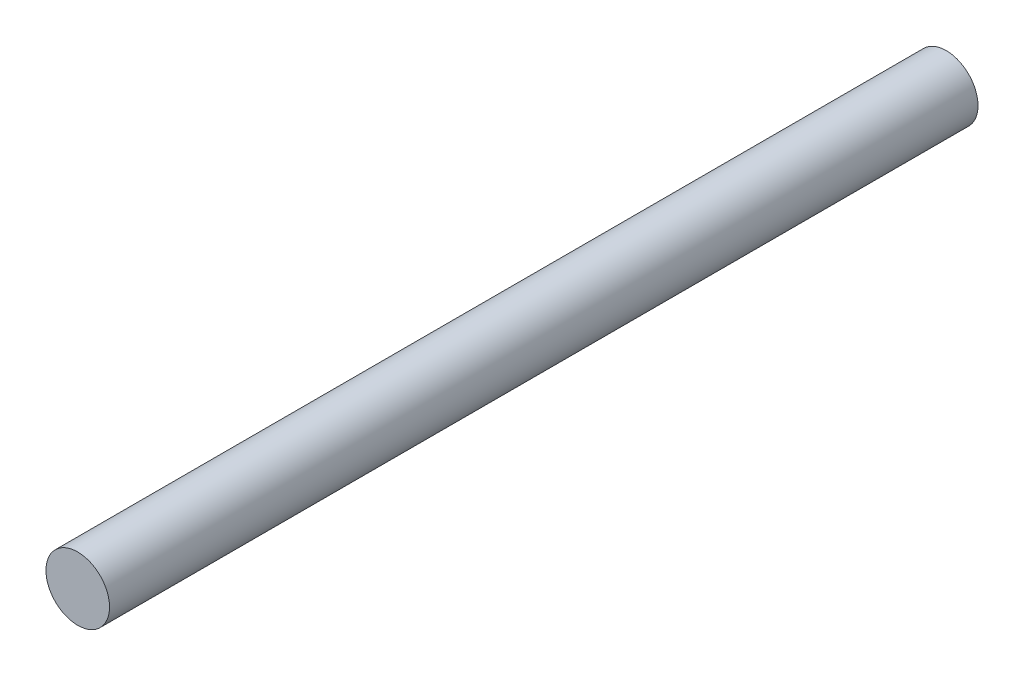
ISO-10303-21;
HEADER;
FILE_DESCRIPTION(('STEP AP214'),'2;1');
FILE_NAME('part.step','',(''),(''),'','','');
FILE_SCHEMA(('AUTOMOTIVE_DESIGN { 1 0 10303 214 1 1 1 1 }'));
ENDSEC;
DATA;
#1=APPLICATION_CONTEXT('core data for automotive mechanical design processes');
#2=APPLICATION_PROTOCOL_DEFINITION('international standard','automotive_design',2000,#1);
#3=PRODUCT_CONTEXT('',#1,'mechanical');
#4=PRODUCT('Part','Part','',(#3));
#5=PRODUCT_RELATED_PRODUCT_CATEGORY('part','',(#4));
#6=PRODUCT_DEFINITION_FORMATION('','',#4);
#7=PRODUCT_DEFINITION_CONTEXT('part definition',#1,'design');
#8=PRODUCT_DEFINITION('design','',#6,#7);
#9=PRODUCT_DEFINITION_SHAPE('','',#8);
#10=(LENGTH_UNIT() NAMED_UNIT(*) SI_UNIT(.MILLI.,.METRE.));
#11=(NAMED_UNIT(*) PLANE_ANGLE_UNIT() SI_UNIT($,.RADIAN.));
#12=(NAMED_UNIT(*) SI_UNIT($,.STERADIAN.) SOLID_ANGLE_UNIT());
#13=UNCERTAINTY_MEASURE_WITH_UNIT(LENGTH_MEASURE(1.E-05),#10,'distance_accuracy_value','');
#14=(GEOMETRIC_REPRESENTATION_CONTEXT(3) GLOBAL_UNCERTAINTY_ASSIGNED_CONTEXT((#13)) GLOBAL_UNIT_ASSIGNED_CONTEXT((#10,
#11,#12)) REPRESENTATION_CONTEXT('',''));
#15=CARTESIAN_POINT('',(0.,0.,0.));
#16=DIRECTION('',(0.,0.,1.));
#17=DIRECTION('',(1.,0.,0.));
#18=AXIS2_PLACEMENT_3D('',#15,#16,#17);
#19=CARTESIAN_POINT('',(0.,0.,53.));
#20=DIRECTION('',(0.,0.,-1.));
#21=DIRECTION('',(-1.,0.,0.));
#22=AXIS2_PLACEMENT_3D('',#19,#20,#21);
#23=CYLINDRICAL_SURFACE('',#22,1.94);
#24=CARTESIAN_POINT('',(0.,0.,53.));
#25=DIRECTION('',(0.,0.,1.));
#26=DIRECTION('',(1.,0.,0.));
#27=AXIS2_PLACEMENT_3D('',#24,#25,#26);
#28=CIRCLE('',#27,1.94);
#29=CARTESIAN_POINT('',(1.94,0.,53.));
#30=VERTEX_POINT('',#29);
#31=EDGE_CURVE('E10',#30,#30,#28,.T.);
#32=ORIENTED_EDGE('',*,*,#31,.F.);
#33=EDGE_LOOP('',(#32));
#34=FACE_BOUND('',#33,.T.);
#35=CARTESIAN_POINT('',(0.,0.,0.));
#36=DIRECTION('',(0.,0.,1.));
#37=DIRECTION('',(1.,0.,0.));
#38=AXIS2_PLACEMENT_3D('',#35,#36,#37);
#39=CIRCLE('',#38,1.94);
#40=CARTESIAN_POINT('',(1.94,0.,0.));
#41=VERTEX_POINT('',#40);
#42=EDGE_CURVE('E42',#41,#41,#39,.T.);
#43=ORIENTED_EDGE('',*,*,#42,.T.);
#44=EDGE_LOOP('',(#43));
#45=FACE_BOUND('',#44,.T.);
#46=ADVANCED_FACE('F39',(#34,#45),#23,.T.);
#47=CARTESIAN_POINT('',(0.,0.,53.));
#48=DIRECTION('',(0.,0.,1.));
#49=DIRECTION('',(1.,0.,0.));
#50=AXIS2_PLACEMENT_3D('',#47,#48,#49);
#51=PLANE('',#50);
#52=ORIENTED_EDGE('',*,*,#31,.T.);
#53=EDGE_LOOP('',(#52));
#54=FACE_BOUND('',#53,.T.);
#55=ADVANCED_FACE('F54',(#54),#51,.T.);
#56=CARTESIAN_POINT('',(0.,0.,0.));
#57=DIRECTION('',(0.,0.,1.));
#58=DIRECTION('',(1.,0.,0.));
#59=AXIS2_PLACEMENT_3D('',#56,#57,#58);
#60=PLANE('',#59);
#61=ORIENTED_EDGE('',*,*,#42,.F.);
#62=EDGE_LOOP('',(#61));
#63=FACE_BOUND('',#62,.T.);
#64=ADVANCED_FACE('F52',(#63),#60,.F.);
#65=CLOSED_SHELL('',(#46,#55,#64));
#66=MANIFOLD_SOLID_BREP('B2',#65);
#67=ADVANCED_BREP_SHAPE_REPRESENTATION('',(#18,#66),#14);
#68=SHAPE_DEFINITION_REPRESENTATION(#9,#67);
ENDSEC;
END-ISO-10303-21;
